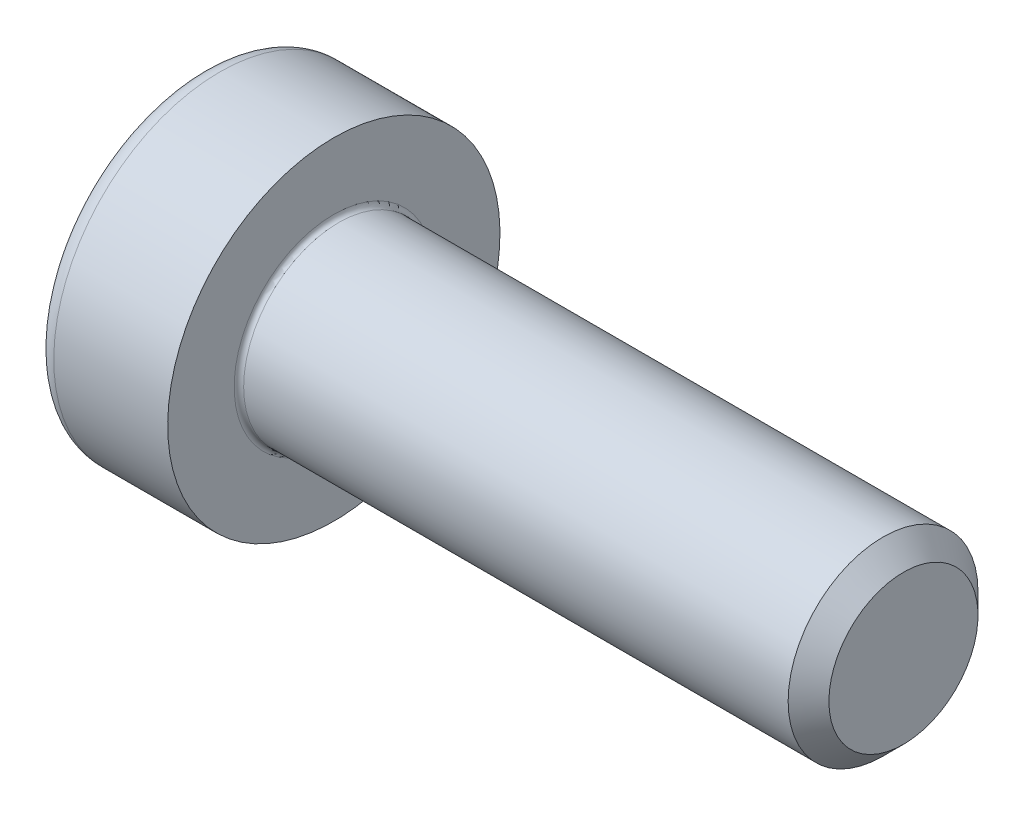
ISO-10303-21;
HEADER;
FILE_DESCRIPTION(('STEP AP214'),'2;1');
FILE_NAME('part.step','',(''),(''),'','','');
FILE_SCHEMA(('AUTOMOTIVE_DESIGN { 1 0 10303 214 1 1 1 1 }'));
ENDSEC;
DATA;
#1=APPLICATION_CONTEXT('core data for automotive mechanical design processes');
#2=APPLICATION_PROTOCOL_DEFINITION('international standard','automotive_design',2000,#1);
#3=PRODUCT_CONTEXT('',#1,'mechanical');
#4=PRODUCT('Part','Part','',(#3));
#5=PRODUCT_RELATED_PRODUCT_CATEGORY('part','',(#4));
#6=PRODUCT_DEFINITION_FORMATION('','',#4);
#7=PRODUCT_DEFINITION_CONTEXT('part definition',#1,'design');
#8=PRODUCT_DEFINITION('design','',#6,#7);
#9=PRODUCT_DEFINITION_SHAPE('','',#8);
#10=(LENGTH_UNIT() NAMED_UNIT(*) SI_UNIT(.MILLI.,.METRE.));
#11=(NAMED_UNIT(*) PLANE_ANGLE_UNIT() SI_UNIT($,.RADIAN.));
#12=(NAMED_UNIT(*) SI_UNIT($,.STERADIAN.) SOLID_ANGLE_UNIT());
#13=UNCERTAINTY_MEASURE_WITH_UNIT(LENGTH_MEASURE(1.E-05),#10,'distance_accuracy_value','');
#14=(GEOMETRIC_REPRESENTATION_CONTEXT(3) GLOBAL_UNCERTAINTY_ASSIGNED_CONTEXT((#13)) GLOBAL_UNIT_ASSIGNED_CONTEXT((#10,
#11,#12)) REPRESENTATION_CONTEXT('',''));
#15=CARTESIAN_POINT('',(0.,0.,0.));
#16=DIRECTION('',(0.,0.,1.));
#17=DIRECTION('',(1.,0.,0.));
#18=AXIS2_PLACEMENT_3D('',#15,#16,#17);
#19=CARTESIAN_POINT('',(-2.8,-1.25,0.721687836487033));
#20=DIRECTION('',(0.,-0.5,0.866025403784439));
#21=DIRECTION('',(0.,-0.866025403784439,-0.5));
#22=AXIS2_PLACEMENT_3D('',#19,#20,#21);
#23=PLANE('',#22);
#24=DIRECTION('',(1.,0.,0.));
#25=VECTOR('',#24,1.);
#26=CARTESIAN_POINT('',(-2.8,-1.25,0.721687836487032));
#27=LINE('',#26,#25);
#28=CARTESIAN_POINT('',(-0.500000000012726,-1.24999999999841,0.721687836486114));
#29=VERTEX_POINT('',#28);
#30=CARTESIAN_POINT('',(-2.8,-1.25,0.721687836487032));
#31=VERTEX_POINT('',#30);
#32=EDGE_CURVE('E79',#29,#31,#27,.F.);
#33=ORIENTED_EDGE('',*,*,#32,.T.);
#34=DIRECTION('',(0.,-0.866025403784439,-0.5));
#35=VECTOR('',#34,1.);
#36=CARTESIAN_POINT('',(-2.8,-1.25,0.721687836487033));
#37=LINE('',#36,#35);
#38=CARTESIAN_POINT('',(-2.8,0.,1.44337567297406));
#39=VERTEX_POINT('',#38);
#40=EDGE_CURVE('E85',#39,#31,#37,.T.);
#41=ORIENTED_EDGE('',*,*,#40,.F.);
#42=DIRECTION('',(1.,0.,0.));
#43=VECTOR('',#42,1.);
#44=CARTESIAN_POINT('',(-2.8,0.,1.44337567297406));
#45=LINE('',#44,#43);
#46=CARTESIAN_POINT('',(-0.500000000013255,-1.59207292378371E-12,1.44337567297314));
#47=VERTEX_POINT('',#46);
#48=EDGE_CURVE('E82',#39,#47,#45,.T.);
#49=ORIENTED_EDGE('',*,*,#48,.T.);
#50=CARTESIAN_POINT('',(-0.500000000012726,-1.24999999999682,0.72168783648887));
#51=CARTESIAN_POINT('',(-0.481684715716377,-1.19507007026983,0.753401646203316));
#52=CARTESIAN_POINT('',(-0.465027923199401,-1.13966598617085,0.785389209072065));
#53=CARTESIAN_POINT('',(-0.435953992136175,-1.0278985333175,0.849918178063587));
#54=CARTESIAN_POINT('',(-0.423547137722017,-0.971533179318236,0.882460730368029));
#55=CARTESIAN_POINT('',(-0.404234974351635,-0.859500978896518,0.947142551439414));
#56=CARTESIAN_POINT('',(-0.397201117258309,-0.803851365235418,0.979271870866949));
#57=CARTESIAN_POINT('',(-0.388805730091798,-0.69229042470667,1.04368160991227));
#58=CARTESIAN_POINT('',(-0.387437246244261,-0.636379503054475,1.0759617955788));
#59=CARTESIAN_POINT('',(-0.390291431357509,-0.531915943927224,1.13627385956143));
#60=CARTESIAN_POINT('',(-0.393813303271098,-0.483347630844075,1.16431478819407));
#61=CARTESIAN_POINT('',(-0.404973312960129,-0.386527411394851,1.22021396795608));
#62=CARTESIAN_POINT('',(-0.412615259241871,-0.338275839654115,1.24807202588941));
#63=CARTESIAN_POINT('',(-0.431718645848268,-0.241256161421971,1.30408636323343));
#64=CARTESIAN_POINT('',(-0.443261026398436,-0.192500327885751,1.33223555685014));
#65=CARTESIAN_POINT('',(-0.469457350536955,-0.0957156437487544,1.38811422029006));
#66=CARTESIAN_POINT('',(-0.484105142982673,-0.0476855541807888,1.41584440543133));
#67=CARTESIAN_POINT('',(-0.500000000012726,-3.18408876986919E-12,1.44337567297223));
#68=B_SPLINE_CURVE_WITH_KNOTS('',3,(#50,#51,#52,#53,#54,#55,#56,#57,#58,#59,#60,#61,#62,#63,#64,
#65,#66,#67),.UNSPECIFIED.,.F.,.F.,(4,2,2,2,2,2,2,2,4),(0.,0.198135007223765,0.396746135643436,
0.590442253847539,0.783900555563555,0.952317364145102,1.12089012111943,1.2932010140512,
1.46517373344049),.UNSPECIFIED.);
#69=EDGE_CURVE('E21',#29,#47,#68,.T.);
#70=ORIENTED_EDGE('',*,*,#69,.F.);
#71=EDGE_LOOP('',(#33,#41,#49,#70));
#72=FACE_BOUND('',#71,.T.);
#73=ADVANCED_FACE('F17',(#72),#23,.F.);
#74=CARTESIAN_POINT('',(-2.8,-1.25,-0.721687836487032));
#75=DIRECTION('',(0.,-1.,0.));
#76=DIRECTION('',(1.,0.,0.));
#77=AXIS2_PLACEMENT_3D('',#74,#75,#76);
#78=PLANE('',#77);
#79=DIRECTION('',(1.,0.,0.));
#80=VECTOR('',#79,1.);
#81=CARTESIAN_POINT('',(-2.8,-1.25,-0.721687836487029));
#82=LINE('',#81,#80);
#83=CARTESIAN_POINT('',(-0.49999999816412,-1.25,-0.7216878300796));
#84=VERTEX_POINT('',#83);
#85=CARTESIAN_POINT('',(-2.8,-1.25,-0.72168783648703));
#86=VERTEX_POINT('',#85);
#87=EDGE_CURVE('E168',#84,#86,#82,.F.);
#88=ORIENTED_EDGE('',*,*,#87,.T.);
#89=DIRECTION('',(0.,0.,1.));
#90=VECTOR('',#89,1.);
#91=CARTESIAN_POINT('',(-2.8,-1.25,-0.721687836487032));
#92=LINE('',#91,#90);
#93=EDGE_CURVE('E96',#31,#86,#92,.F.);
#94=ORIENTED_EDGE('',*,*,#93,.F.);
#95=ORIENTED_EDGE('',*,*,#32,.F.);
#96=CARTESIAN_POINT('',(-0.499999996314455,-1.25,-0.721687823672171));
#97=CARTESIAN_POINT('',(-0.481684712320678,-1.25,-0.658260204455308));
#98=CARTESIAN_POINT('',(-0.465027920125363,-1.25,-0.594285078931179));
#99=CARTESIAN_POINT('',(-0.435953989730311,-1.25,-0.465227141395604));
#100=CARTESIAN_POINT('',(-0.423547135662282,-1.25,-0.400142037020951));
#101=CARTESIAN_POINT('',(-0.404234972978452,-1.25,-0.270778395346219));
#102=CARTESIAN_POINT('',(-0.397201116226907,-1.25,-0.206519756724117));
#103=CARTESIAN_POINT('',(-0.388805729720173,-1.25,-0.0777002791266702));
#104=CARTESIAN_POINT('',(-0.387437246190876,-1.25,-0.0131399080537761));
#105=CARTESIAN_POINT('',(-0.390291431832533,-1.25,0.107484218823611));
#106=CARTESIAN_POINT('',(-0.393813303918129,-1.25,0.163566075265566));
#107=CARTESIAN_POINT('',(-0.404973313813457,-1.25,0.27536443314025));
#108=CARTESIAN_POINT('',(-0.412615260129186,-1.25,0.331080548180939));
#109=CARTESIAN_POINT('',(-0.431718646676558,-1.25,0.443109221187627));
#110=CARTESIAN_POINT('',(-0.443261027129272,-1.25,0.499407607566286));
#111=CARTESIAN_POINT('',(-0.469457350971283,-1.25,0.611164932762984));
#112=CARTESIAN_POINT('',(-0.484105143218355,-1.25,0.666625302217014));
#113=CARTESIAN_POINT('',(-0.500000000012726,-1.25,0.721687836483357));
#114=B_SPLINE_CURVE_WITH_KNOTS('',3,(#96,#97,#98,#99,#100,#101,#102,#103,#104,#105,#106,#107,
#108,#109,#110,#111,#112,#113),.UNSPECIFIED.,.F.,.F.,(4,2,2,2,2,2,2,2,4),(0.,0.19813500635957,
0.396746133892688,0.590442251290265,0.783900552208119,0.952317358365276,1.12089011290585,
1.29320100327195,1.46517372011195),.UNSPECIFIED.);
#115=EDGE_CURVE('E87',#84,#29,#114,.T.);
#116=ORIENTED_EDGE('',*,*,#115,.F.);
#117=EDGE_LOOP('',(#88,#94,#95,#116));
#118=FACE_BOUND('',#117,.T.);
#119=ADVANCED_FACE('F97',(#118),#78,.F.);
#120=CARTESIAN_POINT('',(-2.8,0.,1.44337567297406));
#121=DIRECTION('',(0.,0.500000000000001,0.866025403784438));
#122=DIRECTION('',(0.,-0.866025403784438,0.500000000000001));
#123=AXIS2_PLACEMENT_3D('',#120,#121,#122);
#124=PLANE('',#123);
#125=ORIENTED_EDGE('',*,*,#48,.F.);
#126=DIRECTION('',(0.,-0.866025403784438,0.500000000000001));
#127=VECTOR('',#126,1.);
#128=CARTESIAN_POINT('',(-2.8,0.,1.44337567297406));
#129=LINE('',#128,#127);
#130=CARTESIAN_POINT('',(-2.8,1.25,0.721687836487029));
#131=VERTEX_POINT('',#130);
#132=EDGE_CURVE('E95',#131,#39,#129,.T.);
#133=ORIENTED_EDGE('',*,*,#132,.F.);
#134=DIRECTION('',(1.,0.,0.));
#135=VECTOR('',#134,1.);
#136=CARTESIAN_POINT('',(-2.8,1.25,0.72168783648703));
#137=LINE('',#136,#135);
#138=CARTESIAN_POINT('',(-0.500000004821645,1.25000001442358,0.721687828159571));
#139=VERTEX_POINT('',#138);
#140=EDGE_CURVE('E269',#131,#139,#137,.T.);
#141=ORIENTED_EDGE('',*,*,#140,.T.);
#142=CARTESIAN_POINT('',(-0.500000000012724,3.18080698857283E-12,1.44337567297222));
#143=CARTESIAN_POINT('',(-0.481684715713841,0.05492992973787,1.41166186325333));
#144=CARTESIAN_POINT('',(-0.465027923194758,0.110334013844639,1.37967430038009));
#145=CARTESIAN_POINT('',(-0.435953992128384,0.222101466714794,1.31514533137886));
#146=CARTESIAN_POINT('',(-0.423547137713265,0.278466820723083,1.28260277906921));
#147=CARTESIAN_POINT('',(-0.404234974345858,0.39049902114616,1.21792095799704));
#148=CARTESIAN_POINT('',(-0.397201117254907,0.446148634799383,1.18579163857405));
#149=CARTESIAN_POINT('',(-0.388805730091247,0.55770957531095,1.12138189953865));
#150=CARTESIAN_POINT('',(-0.387437246244113,0.613620496953838,1.08910171387749));
#151=CARTESIAN_POINT('',(-0.390291431412486,0.71808405807321,1.02878964874471));
#152=CARTESIAN_POINT('',(-0.393813303562025,0.766652373153495,1.00074871895902));
#153=CARTESIAN_POINT('',(-0.404973314047567,0.863472596563807,0.94484953691008));
#154=CARTESIAN_POINT('',(-0.412615260890639,0.911724170268415,0.916991477842901));
#155=CARTESIAN_POINT('',(-0.431718648896679,1.00874385247376,0.860977138204952));
#156=CARTESIAN_POINT('',(-0.443261030295299,1.05749968801736,0.83282794342929));
#157=CARTESIAN_POINT('',(-0.469457356315246,1.15428437609608,0.776949277713607));
#158=CARTESIAN_POINT('',(-0.484105149792817,1.20231446759865,0.749219091455394));
#159=CARTESIAN_POINT('',(-0.500000007908364,1.25000002368374,0.721687822813215));
#160=B_SPLINE_CURVE_WITH_KNOTS('',3,(#142,#143,#144,#145,#146,#147,#148,#149,#150,#151,#152,
#153,#154,#155,#156,#157,#158,#159),.UNSPECIFIED.,.F.,.F.,(4,2,2,2,2,2,2,2,4),(0.,
0.198135007251438,0.396746135702335,0.590442253878284,0.783900555563566,0.952317371073209,
1.12089013500126,1.29320103524786,1.46517376189628),.UNSPECIFIED.);
#161=EDGE_CURVE('E162',#47,#139,#160,.T.);
#162=ORIENTED_EDGE('',*,*,#161,.F.);
#163=EDGE_LOOP('',(#125,#133,#141,#162));
#164=FACE_BOUND('',#163,.T.);
#165=ADVANCED_FACE('F169',(#164),#124,.F.);
#166=CARTESIAN_POINT('',(-2.8,0.,-1.44337567297406));
#167=DIRECTION('',(0.,-0.5,-0.866025403784439));
#168=DIRECTION('',(0.,0.866025403784439,-0.5));
#169=AXIS2_PLACEMENT_3D('',#166,#167,#168);
#170=PLANE('',#169);
#171=DIRECTION('',(1.,0.,0.));
#172=VECTOR('',#171,1.);
#173=CARTESIAN_POINT('',(-2.8,0.,-1.44337567297406));
#174=LINE('',#173,#172);
#175=CARTESIAN_POINT('',(-0.499999992316163,-5.1913156715445E-08,-1.44337565964139));
#176=VERTEX_POINT('',#175);
#177=CARTESIAN_POINT('',(-2.8,0.,-1.44337567297406));
#178=VERTEX_POINT('',#177);
#179=EDGE_CURVE('E263',#176,#178,#174,.F.);
#180=ORIENTED_EDGE('',*,*,#179,.T.);
#181=DIRECTION('',(0.,0.866025403784439,-0.5));
#182=VECTOR('',#181,1.);
#183=CARTESIAN_POINT('',(-2.8,0.,-1.44337567297406));
#184=LINE('',#183,#182);
#185=EDGE_CURVE('E41',#86,#178,#184,.T.);
#186=ORIENTED_EDGE('',*,*,#185,.F.);
#187=ORIENTED_EDGE('',*,*,#87,.F.);
#188=CARTESIAN_POINT('',(-0.500000009620751,-1.2500000288209,-0.721687819847277));
#189=CARTESIAN_POINT('',(-0.481684724546346,-1.19507009864123,-0.753401629823076));
#190=CARTESIAN_POINT('',(-0.46502793120038,-1.13966601408686,-0.785389192954742));
#191=CARTESIAN_POINT('',(-0.435953998411218,-1.02789856027996,-0.8499181624968));
#192=CARTESIAN_POINT('',(-0.423547143100863,-0.971533205782277,-0.882460715089003));
#193=CARTESIAN_POINT('',(-0.404234977937411,-0.85950100431182,-0.947142536765877));
#194=CARTESIAN_POINT('',(-0.39720111994863,-0.803851390101623,-0.979271856510434));
#195=CARTESIAN_POINT('',(-0.388805731059005,-0.692290448408831,-1.04368159622782));
#196=CARTESIAN_POINT('',(-0.387437246383409,-0.636379526141792,-1.07596178224933));
#197=CARTESIAN_POINT('',(-0.390291429949312,-0.531915970874843,-1.13627384400321));
#198=CARTESIAN_POINT('',(-0.393813300668912,-0.483347662263053,-1.16431477005431));
#199=CARTESIAN_POINT('',(-0.404973307299901,-0.386527451645454,-1.22021394471738));
#200=CARTESIAN_POINT('',(-0.412615251715936,-0.338275884264775,-1.24807200013343));
#201=CARTESIAN_POINT('',(-0.431718634043812,-0.241256214830581,-1.30408633239795));
#202=CARTESIAN_POINT('',(-0.443261012160607,-0.192500385727477,-1.33223552345519));
#203=CARTESIAN_POINT('',(-0.469457331112052,-0.0957157102846819,-1.38811418187552));
#204=CARTESIAN_POINT('',(-0.484105120806564,-0.0476856249784376,-1.41584436455628));
#205=CARTESIAN_POINT('',(-0.499999975011777,-7.50060251231076E-08,-1.44337562966931));
#206=B_SPLINE_CURVE_WITH_KNOTS('',3,(#188,#189,#190,#191,#192,#193,#194,#195,#196,#197,#198,
#199,#200,#201,#202,#203,#204,#205),.UNSPECIFIED.,.F.,.F.,(4,2,2,2,2,2,2,2,4),(0.,
0.198135009381301,0.396746140005334,0.59044226039392,0.783900564280859,0.952317357223632,
1.12089009850234,1.29320097493783,1.4651736779646),.UNSPECIFIED.);
#207=EDGE_CURVE('E91',#84,#176,#206,.T.);
#208=ORIENTED_EDGE('',*,*,#207,.T.);
#209=EDGE_LOOP('',(#180,#186,#187,#208));
#210=FACE_BOUND('',#209,.T.);
#211=ADVANCED_FACE('F172',(#210),#170,.F.);
#212=CARTESIAN_POINT('',(-2.8,1.25,0.72168783648703));
#213=DIRECTION('',(0.,1.,0.));
#214=DIRECTION('',(0.,0.,1.));
#215=AXIS2_PLACEMENT_3D('',#212,#213,#214);
#216=PLANE('',#215);
#217=ORIENTED_EDGE('',*,*,#140,.F.);
#218=DIRECTION('',(0.,0.,1.));
#219=VECTOR('',#218,1.);
#220=CARTESIAN_POINT('',(-2.8,1.25,0.72168783648703));
#221=LINE('',#220,#219);
#222=CARTESIAN_POINT('',(-2.8,1.25,-0.721687836487033));
#223=VERTEX_POINT('',#222);
#224=EDGE_CURVE('E272',#223,#131,#221,.T.);
#225=ORIENTED_EDGE('',*,*,#224,.F.);
#226=DIRECTION('',(1.,0.,0.));
#227=VECTOR('',#226,1.);
#228=CARTESIAN_POINT('',(-2.8,1.25,-0.721687836487033));
#229=LINE('',#228,#227);
#230=CARTESIAN_POINT('',(-0.500000004817269,1.25,-0.721687853126786));
#231=VERTEX_POINT('',#230);
#232=EDGE_CURVE('E131',#223,#231,#229,.T.);
#233=ORIENTED_EDGE('',*,*,#232,.T.);
#234=CARTESIAN_POINT('',(-0.500000009620752,1.25,-0.721687869766538));
#235=CARTESIAN_POINT('',(-0.481684724546345,1.25,-0.658260249814932));
#236=CARTESIAN_POINT('',(-0.465027931200377,1.25,-0.594285123551593));
#237=CARTESIAN_POINT('',(-0.435953998411213,1.25,-0.465227184467461));
#238=CARTESIAN_POINT('',(-0.423547143100857,1.25,-0.400142079283045));
#239=CARTESIAN_POINT('',(-0.404234977937408,1.25,-0.270778435929295));
#240=CARTESIAN_POINT('',(-0.397201119948629,1.25,-0.20651979644019));
#241=CARTESIAN_POINT('',(-0.388805731059006,1.25,-0.0777003170054429));
#242=CARTESIAN_POINT('',(-0.38743724638341,1.25,-0.0131399449624222));
#243=CARTESIAN_POINT('',(-0.390291429949361,1.25,0.107484178547275));
#244=CARTESIAN_POINT('',(-0.393813300669159,1.25,0.163566030651423));
#245=CARTESIAN_POINT('',(-0.40497330730082,1.25,0.275364379981414));
#246=CARTESIAN_POINT('',(-0.412615251717328,1.25,0.33108049081544));
#247=CARTESIAN_POINT('',(-0.431718634046385,1.25,0.44310915534835));
#248=CARTESIAN_POINT('',(-0.443261012163895,1.25,0.499407537464786));
#249=CARTESIAN_POINT('',(-0.469457331116927,1.25,0.611164854309281));
#250=CARTESIAN_POINT('',(-0.484105120812309,1.25,0.666625219672687));
#251=CARTESIAN_POINT('',(-0.499999975018438,1.25,0.7216877499006));
#252=B_SPLINE_CURVE_WITH_KNOTS('',3,(#234,#235,#236,#237,#238,#239,#240,#241,#242,#243,#244,
#245,#246,#247,#248,#249,#250,#251),.UNSPECIFIED.,.F.,.F.,(4,2,2,2,2,2,2,2,4),(0.,
0.198135009381324,0.396746140005384,0.590442260393947,0.78390056428086,0.952317357229476,
1.12089009851405,1.29320097495571,1.4651736779886),.UNSPECIFIED.);
#253=EDGE_CURVE('E132',#231,#139,#252,.T.);
#254=ORIENTED_EDGE('',*,*,#253,.T.);
#255=EDGE_LOOP('',(#217,#225,#233,#254));
#256=FACE_BOUND('',#255,.T.);
#257=ADVANCED_FACE('F144',(#256),#216,.F.);
#258=CARTESIAN_POINT('',(-0.504999999975553,0.,0.));
#259=DIRECTION('',(-1.,0.,0.));
#260=DIRECTION('',(0.,0.,1.));
#261=AXIS2_PLACEMENT_3D('',#258,#259,#260);
#262=CONICAL_SURFACE('',#261,1.45203592694543,1.04719755118368);
#263=CARTESIAN_POINT('',(0.333333333344399,0.,0.));
#264=VERTEX_POINT('',#263);
#265=VERTEX_LOOP('',#264);
#266=FACE_BOUND('',#265,.T.);
#267=ORIENTED_EDGE('',*,*,#253,.F.);
#268=CARTESIAN_POINT('',(-0.499999996314455,1.249999988902,-0.721687842894464));
#269=CARTESIAN_POINT('',(-0.481684712318148,1.19507005935095,-0.753401652507334));
#270=CARTESIAN_POINT('',(-0.465027920120727,1.13966597542897,-0.785389215273892));
#271=CARTESIAN_POINT('',(-0.435953989722532,1.02789852294635,-0.849918184051369));
#272=CARTESIAN_POINT('',(-0.423547135653544,0.971533169140927,-0.882460736243901));
#273=CARTESIAN_POINT('',(-0.404234972972686,0.859500969123183,-0.947142557082051));
#274=CARTESIAN_POINT('',(-0.397201116223512,0.803851355671706,-0.97927187638856));
#275=CARTESIAN_POINT('',(-0.388805729719625,0.692290415587236,-1.04368161517738));
#276=CARTESIAN_POINT('',(-0.387437246190732,0.636379494169655,-1.07596180070846));
#277=CARTESIAN_POINT('',(-0.390291431887446,0.531915933994866,-1.13627386529588));
#278=CARTESIAN_POINT('',(-0.3938133042087,0.483347619630076,-1.16431479466848));
#279=CARTESIAN_POINT('',(-0.404973314899552,0.386527397653032,-1.22021397588992));
#280=CARTESIAN_POINT('',(-0.412615261775916,0.338275824666179,-1.2480720345427));
#281=CARTESIAN_POINT('',(-0.4317186497212,0.241256143921843,-1.30408637333714));
#282=CARTESIAN_POINT('',(-0.443261031021314,0.192500309120957,-1.33223556768399));
#283=CARTESIAN_POINT('',(-0.469457356742425,0.095715622504775,-1.38811423255528));
#284=CARTESIAN_POINT('',(-0.484105150020072,0.0476855317221033,-1.41584441839786));
#285=CARTESIAN_POINT('',(-0.500000007898593,-2.36544184156069E-08,-1.44337568663095));
#286=B_SPLINE_CURVE_WITH_KNOTS('',3,(#268,#269,#270,#271,#272,#273,#274,#275,#276,#277,#278,
#279,#280,#281,#282,#283,#284,#285),.UNSPECIFIED.,.F.,.F.,(4,2,2,2,2,2,2,2,4),(0.,
0.198135006387209,0.396746133951516,0.590442251320974,0.783900552208132,0.952317365284808,
1.1208901267705,1.29320102444237,1.46517374853252),.UNSPECIFIED.);
#287=EDGE_CURVE('E123',#231,#176,#286,.T.);
#288=ORIENTED_EDGE('',*,*,#287,.T.);
#289=ORIENTED_EDGE('',*,*,#207,.F.);
#290=ORIENTED_EDGE('',*,*,#115,.T.);
#291=ORIENTED_EDGE('',*,*,#69,.T.);
#292=ORIENTED_EDGE('',*,*,#161,.T.);
#293=EDGE_LOOP('',(#267,#288,#289,#290,#291,#292));
#294=FACE_BOUND('',#293,.T.);
#295=ADVANCED_FACE('F89',(#266,#294),#262,.F.);
#296=CARTESIAN_POINT('',(-2.8,1.25,-0.721687836487033));
#297=DIRECTION('',(0.,0.5,-0.866025403784439));
#298=DIRECTION('',(0.,0.866025403784439,0.5));
#299=AXIS2_PLACEMENT_3D('',#296,#297,#298);
#300=PLANE('',#299);
#301=ORIENTED_EDGE('',*,*,#232,.F.);
#302=DIRECTION('',(0.,0.86602540378444,0.499999999999997));
#303=VECTOR('',#302,1.);
#304=CARTESIAN_POINT('',(-2.8,0.,-1.44337567297406));
#305=LINE('',#304,#303);
#306=EDGE_CURVE('E130',#178,#223,#305,.T.);
#307=ORIENTED_EDGE('',*,*,#306,.F.);
#308=ORIENTED_EDGE('',*,*,#179,.F.);
#309=ORIENTED_EDGE('',*,*,#287,.F.);
#310=EDGE_LOOP('',(#301,#307,#308,#309));
#311=FACE_BOUND('',#310,.T.);
#312=ADVANCED_FACE('F139',(#311),#300,.F.);
#313=CARTESIAN_POINT('',(-2.8,2.47168783648703,0.));
#314=DIRECTION('',(-1.,0.,0.));
#315=DIRECTION('',(0.,-1.,0.));
#316=AXIS2_PLACEMENT_3D('',#313,#314,#315);
#317=PLANE('',#316);
#318=ORIENTED_EDGE('',*,*,#185,.T.);
#319=ORIENTED_EDGE('',*,*,#306,.T.);
#320=ORIENTED_EDGE('',*,*,#224,.T.);
#321=ORIENTED_EDGE('',*,*,#132,.T.);
#322=ORIENTED_EDGE('',*,*,#40,.T.);
#323=ORIENTED_EDGE('',*,*,#93,.T.);
#324=EDGE_LOOP('',(#318,#319,#320,#321,#322,#323));
#325=FACE_BOUND('',#324,.T.);
#326=CARTESIAN_POINT('',(-2.8,0.,0.));
#327=DIRECTION('',(1.,0.,0.));
#328=DIRECTION('',(0.,1.,0.));
#329=AXIS2_PLACEMENT_3D('',#326,#327,#328);
#330=CIRCLE('',#329,3.1);
#331=CARTESIAN_POINT('',(-2.8,3.1,0.));
#332=VERTEX_POINT('',#331);
#333=EDGE_CURVE('E244',#332,#332,#330,.T.);
#334=ORIENTED_EDGE('',*,*,#333,.F.);
#335=EDGE_LOOP('',(#334));
#336=FACE_BOUND('',#335,.T.);
#337=ADVANCED_FACE('F231',(#325,#336),#317,.T.);
#338=CARTESIAN_POINT('',(-2.4,0.,0.));
#339=DIRECTION('',(1.,0.,0.));
#340=DIRECTION('',(0.,0.,-1.));
#341=AXIS2_PLACEMENT_3D('',#338,#339,#340);
#342=TOROIDAL_SURFACE('',#341,3.1,0.4);
#343=CARTESIAN_POINT('',(-2.4,0.,0.));
#344=DIRECTION('',(1.,0.,0.));
#345=DIRECTION('',(0.,1.,0.));
#346=AXIS2_PLACEMENT_3D('',#343,#344,#345);
#347=CIRCLE('',#346,3.5);
#348=CARTESIAN_POINT('',(-2.4,3.5,0.));
#349=VERTEX_POINT('',#348);
#350=EDGE_CURVE('E120',#349,#349,#347,.T.);
#351=ORIENTED_EDGE('',*,*,#350,.F.);
#352=EDGE_LOOP('',(#351));
#353=FACE_BOUND('',#352,.T.);
#354=ORIENTED_EDGE('',*,*,#333,.T.);
#355=EDGE_LOOP('',(#354));
#356=FACE_BOUND('',#355,.T.);
#357=ADVANCED_FACE('F226',(#353,#356),#342,.T.);
#358=CARTESIAN_POINT('',(-1.4,0.,0.));
#359=DIRECTION('',(1.,0.,0.));
#360=DIRECTION('',(0.,1.,0.));
#361=AXIS2_PLACEMENT_3D('',#358,#359,#360);
#362=CYLINDRICAL_SURFACE('',#361,3.5);
#363=ORIENTED_EDGE('',*,*,#350,.T.);
#364=EDGE_LOOP('',(#363));
#365=FACE_BOUND('',#364,.T.);
#366=CARTESIAN_POINT('',(0.,0.,0.));
#367=DIRECTION('',(1.,0.,0.));
#368=DIRECTION('',(0.,1.,0.));
#369=AXIS2_PLACEMENT_3D('',#366,#367,#368);
#370=CIRCLE('',#369,3.5);
#371=CARTESIAN_POINT('',(0.,3.5,0.));
#372=VERTEX_POINT('',#371);
#373=EDGE_CURVE('E115',#372,#372,#370,.T.);
#374=ORIENTED_EDGE('',*,*,#373,.F.);
#375=EDGE_LOOP('',(#374));
#376=FACE_BOUND('',#375,.T.);
#377=ADVANCED_FACE('F222',(#365,#376),#362,.T.);
#378=CARTESIAN_POINT('',(12.,1.,0.));
#379=DIRECTION('',(1.,0.,0.));
#380=DIRECTION('',(0.,1.,0.));
#381=AXIS2_PLACEMENT_3D('',#378,#379,#380);
#382=PLANE('',#381);
#383=CARTESIAN_POINT('',(12.0000000000573,0.,0.));
#384=DIRECTION('',(-1.,0.,0.));
#385=DIRECTION('',(0.,0.,1.));
#386=AXIS2_PLACEMENT_3D('',#383,#384,#385);
#387=CIRCLE('',#386,1.57058500002449);
#388=CARTESIAN_POINT('',(12.0000000000573,0.,1.57058500002449));
#389=VERTEX_POINT('',#388);
#390=EDGE_CURVE('E111',#389,#389,#387,.T.);
#391=ORIENTED_EDGE('',*,*,#390,.F.);
#392=EDGE_LOOP('',(#391));
#393=FACE_BOUND('',#392,.T.);
#394=ADVANCED_FACE('F219',(#393),#382,.T.);
#395=CARTESIAN_POINT('',(0.,2.75,0.));
#396=DIRECTION('',(1.,0.,0.));
#397=DIRECTION('',(0.,1.,0.));
#398=AXIS2_PLACEMENT_3D('',#395,#396,#397);
#399=PLANE('',#398);
#400=CARTESIAN_POINT('',(0.,0.,0.));
#401=DIRECTION('',(1.,0.,0.));
#402=DIRECTION('',(0.,1.,0.));
#403=AXIS2_PLACEMENT_3D('',#400,#401,#402);
#404=CIRCLE('',#403,2.1);
#405=CARTESIAN_POINT('',(0.,2.1,0.));
#406=VERTEX_POINT('',#405);
#407=EDGE_CURVE('E114',#406,#406,#404,.F.);
#408=ORIENTED_EDGE('',*,*,#407,.T.);
#409=EDGE_LOOP('',(#408));
#410=FACE_BOUND('',#409,.T.);
#411=ORIENTED_EDGE('',*,*,#373,.T.);
#412=EDGE_LOOP('',(#411));
#413=FACE_BOUND('',#412,.T.);
#414=ADVANCED_FACE('F210',(#410,#413),#399,.T.);
#415=CARTESIAN_POINT('',(11.5705850000722,0.,0.));
#416=DIRECTION('',(-1.,0.,0.));
#417=DIRECTION('',(0.,0.,1.));
#418=AXIS2_PLACEMENT_3D('',#415,#416,#417);
#419=CONICAL_SURFACE('',#418,2.00000000000955,0.785398163397448);
#420=ORIENTED_EDGE('',*,*,#390,.T.);
#421=EDGE_LOOP('',(#420));
#422=FACE_BOUND('',#421,.T.);
#423=CARTESIAN_POINT('',(11.570585,0.,0.));
#424=DIRECTION('',(1.,0.,0.));
#425=DIRECTION('',(0.,1.,0.));
#426=AXIS2_PLACEMENT_3D('',#423,#424,#425);
#427=CIRCLE('',#426,2.);
#428=CARTESIAN_POINT('',(11.570585,2.,0.));
#429=VERTEX_POINT('',#428);
#430=EDGE_CURVE('E32',#429,#429,#427,.F.);
#431=ORIENTED_EDGE('',*,*,#430,.F.);
#432=EDGE_LOOP('',(#431));
#433=FACE_BOUND('',#432,.T.);
#434=ADVANCED_FACE('F189',(#422,#433),#419,.T.);
#435=CARTESIAN_POINT('',(0.100000000000002,0.,0.));
#436=DIRECTION('',(1.,0.,0.));
#437=DIRECTION('',(0.,0.,-1.));
#438=AXIS2_PLACEMENT_3D('',#435,#436,#437);
#439=TOROIDAL_SURFACE('',#438,2.1,0.1);
#440=CARTESIAN_POINT('',(0.100000000000002,0.,0.));
#441=DIRECTION('',(1.,0.,0.));
#442=DIRECTION('',(0.,1.,0.));
#443=AXIS2_PLACEMENT_3D('',#440,#441,#442);
#444=CIRCLE('',#443,2.);
#445=CARTESIAN_POINT('',(0.100000000000002,2.,0.));
#446=VERTEX_POINT('',#445);
#447=EDGE_CURVE('E11',#446,#446,#444,.T.);
#448=ORIENTED_EDGE('',*,*,#447,.F.);
#449=EDGE_LOOP('',(#448));
#450=FACE_BOUND('',#449,.T.);
#451=ORIENTED_EDGE('',*,*,#407,.F.);
#452=EDGE_LOOP('',(#451));
#453=FACE_BOUND('',#452,.T.);
#454=ADVANCED_FACE('F183',(#450,#453),#439,.F.);
#455=CARTESIAN_POINT('',(7.05,0.,0.));
#456=DIRECTION('',(1.,0.,0.));
#457=DIRECTION('',(0.,1.,0.));
#458=AXIS2_PLACEMENT_3D('',#455,#456,#457);
#459=CYLINDRICAL_SURFACE('',#458,2.);
#460=ORIENTED_EDGE('',*,*,#447,.T.);
#461=EDGE_LOOP('',(#460));
#462=FACE_BOUND('',#461,.T.);
#463=ORIENTED_EDGE('',*,*,#430,.T.);
#464=EDGE_LOOP('',(#463));
#465=FACE_BOUND('',#464,.T.);
#466=ADVANCED_FACE('F181',(#462,#465),#459,.T.);
#467=CLOSED_SHELL('',(#73,#119,#165,#211,#257,#295,#312,#337,#357,#377,#394,#414,#434,#454,#466));
#468=MANIFOLD_SOLID_BREP('B1',#467);
#469=ADVANCED_BREP_SHAPE_REPRESENTATION('',(#18,#468),#14);
#470=SHAPE_DEFINITION_REPRESENTATION(#9,#469);
ENDSEC;
END-ISO-10303-21;
